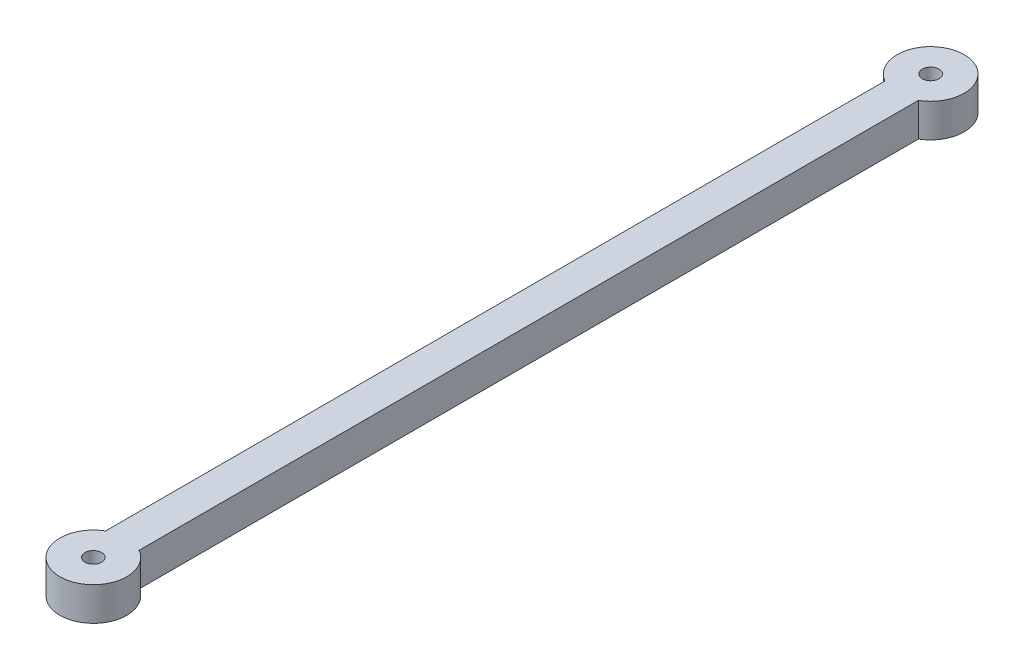
ISO-10303-21;
HEADER;
FILE_DESCRIPTION(('STEP AP214'),'2;1');
FILE_NAME('part.step','',(''),(''),'','','');
FILE_SCHEMA(('AUTOMOTIVE_DESIGN { 1 0 10303 214 1 1 1 1 }'));
ENDSEC;
DATA;
#1=APPLICATION_CONTEXT('core data for automotive mechanical design processes');
#2=APPLICATION_PROTOCOL_DEFINITION('international standard','automotive_design',2000,#1);
#3=PRODUCT_CONTEXT('',#1,'mechanical');
#4=PRODUCT('Part','Part','',(#3));
#5=PRODUCT_RELATED_PRODUCT_CATEGORY('part','',(#4));
#6=PRODUCT_DEFINITION_FORMATION('','',#4);
#7=PRODUCT_DEFINITION_CONTEXT('part definition',#1,'design');
#8=PRODUCT_DEFINITION('design','',#6,#7);
#9=PRODUCT_DEFINITION_SHAPE('','',#8);
#10=(LENGTH_UNIT() NAMED_UNIT(*) SI_UNIT(.MILLI.,.METRE.));
#11=(NAMED_UNIT(*) PLANE_ANGLE_UNIT() SI_UNIT($,.RADIAN.));
#12=(NAMED_UNIT(*) SI_UNIT($,.STERADIAN.) SOLID_ANGLE_UNIT());
#13=UNCERTAINTY_MEASURE_WITH_UNIT(LENGTH_MEASURE(1.E-05),#10,'distance_accuracy_value','');
#14=(GEOMETRIC_REPRESENTATION_CONTEXT(3) GLOBAL_UNCERTAINTY_ASSIGNED_CONTEXT((#13)) GLOBAL_UNIT_ASSIGNED_CONTEXT((#10,
#11,#12)) REPRESENTATION_CONTEXT('',''));
#15=CARTESIAN_POINT('',(0.,0.,0.));
#16=DIRECTION('',(0.,0.,1.));
#17=DIRECTION('',(1.,0.,0.));
#18=AXIS2_PLACEMENT_3D('',#15,#16,#17);
#19=CARTESIAN_POINT('',(0.,6.,-150.));
#20=DIRECTION('',(0.,-1.,0.));
#21=DIRECTION('',(0.,0.,-1.));
#22=AXIS2_PLACEMENT_3D('',#19,#20,#21);
#23=CYLINDRICAL_SURFACE('',#22,6.);
#24=CARTESIAN_POINT('',(0.,0.,-150.));
#25=DIRECTION('',(0.,1.,0.));
#26=DIRECTION('',(0.,0.,1.));
#27=AXIS2_PLACEMENT_3D('',#24,#25,#26);
#28=CIRCLE('',#27,6.);
#29=CARTESIAN_POINT('',(2.99999999999998,0.,-144.803847577293));
#30=VERTEX_POINT('',#29);
#31=CARTESIAN_POINT('',(-3.,0.,-144.803847577293));
#32=VERTEX_POINT('',#31);
#33=EDGE_CURVE('E110',#30,#32,#28,.T.);
#34=ORIENTED_EDGE('',*,*,#33,.T.);
#35=DIRECTION('',(0.,-1.,0.));
#36=VECTOR('',#35,1.);
#37=CARTESIAN_POINT('',(-3.,6.,-144.803847577293));
#38=LINE('',#37,#36);
#39=CARTESIAN_POINT('',(-3.,6.,-144.803847577293));
#40=VERTEX_POINT('',#39);
#41=EDGE_CURVE('E11',#40,#32,#38,.T.);
#42=ORIENTED_EDGE('',*,*,#41,.F.);
#43=CARTESIAN_POINT('',(0.,6.,-150.));
#44=DIRECTION('',(0.,1.,0.));
#45=DIRECTION('',(0.,0.,1.));
#46=AXIS2_PLACEMENT_3D('',#43,#44,#45);
#47=CIRCLE('',#46,6.);
#48=CARTESIAN_POINT('',(2.99999999999998,6.,-144.803847577293));
#49=VERTEX_POINT('',#48);
#50=EDGE_CURVE('E79',#49,#40,#47,.T.);
#51=ORIENTED_EDGE('',*,*,#50,.F.);
#52=DIRECTION('',(0.,-1.,0.));
#53=VECTOR('',#52,1.);
#54=CARTESIAN_POINT('',(2.99999999999998,6.,-144.803847577293));
#55=LINE('',#54,#53);
#56=EDGE_CURVE('E54',#49,#30,#55,.T.);
#57=ORIENTED_EDGE('',*,*,#56,.T.);
#58=EDGE_LOOP('',(#34,#42,#51,#57));
#59=FACE_BOUND('',#58,.T.);
#60=ADVANCED_FACE('F37',(#59),#23,.T.);
#61=CARTESIAN_POINT('',(-3.,6.,0.));
#62=DIRECTION('',(-1.,0.,0.));
#63=DIRECTION('',(0.,0.,1.));
#64=AXIS2_PLACEMENT_3D('',#61,#62,#63);
#65=PLANE('',#64);
#66=DIRECTION('',(0.,0.,-1.));
#67=VECTOR('',#66,1.);
#68=CARTESIAN_POINT('',(-3.,0.,0.));
#69=LINE('',#68,#67);
#70=CARTESIAN_POINT('',(-3.,0.,-5.19615242270663));
#71=VERTEX_POINT('',#70);
#72=EDGE_CURVE('E89',#71,#32,#69,.T.);
#73=ORIENTED_EDGE('',*,*,#72,.F.);
#74=DIRECTION('',(0.,-1.,0.));
#75=VECTOR('',#74,1.);
#76=CARTESIAN_POINT('',(-3.,6.,-5.19615242270663));
#77=LINE('',#76,#75);
#78=CARTESIAN_POINT('',(-3.,6.,-5.19615242270663));
#79=VERTEX_POINT('',#78);
#80=EDGE_CURVE('E46',#79,#71,#77,.T.);
#81=ORIENTED_EDGE('',*,*,#80,.F.);
#82=DIRECTION('',(0.,0.,-1.));
#83=VECTOR('',#82,1.);
#84=CARTESIAN_POINT('',(-3.,6.,0.));
#85=LINE('',#84,#83);
#86=EDGE_CURVE('E87',#79,#40,#85,.T.);
#87=ORIENTED_EDGE('',*,*,#86,.T.);
#88=ORIENTED_EDGE('',*,*,#41,.T.);
#89=EDGE_LOOP('',(#73,#81,#87,#88));
#90=FACE_BOUND('',#89,.T.);
#91=ADVANCED_FACE('F86',(#90),#65,.T.);
#92=CARTESIAN_POINT('',(0.,6.,0.));
#93=DIRECTION('',(0.,-1.,0.));
#94=DIRECTION('',(0.,0.,-1.));
#95=AXIS2_PLACEMENT_3D('',#92,#93,#94);
#96=CYLINDRICAL_SURFACE('',#95,6.);
#97=CARTESIAN_POINT('',(0.,0.,0.));
#98=DIRECTION('',(0.,1.,0.));
#99=DIRECTION('',(0.,0.,1.));
#100=AXIS2_PLACEMENT_3D('',#97,#98,#99);
#101=CIRCLE('',#100,6.);
#102=CARTESIAN_POINT('',(3.,0.,-5.19615242270663));
#103=VERTEX_POINT('',#102);
#104=EDGE_CURVE('E113',#71,#103,#101,.T.);
#105=ORIENTED_EDGE('',*,*,#104,.T.);
#106=DIRECTION('',(0.,-1.,0.));
#107=VECTOR('',#106,1.);
#108=CARTESIAN_POINT('',(3.,6.,-5.19615242270663));
#109=LINE('',#108,#107);
#110=CARTESIAN_POINT('',(3.,6.,-5.19615242270663));
#111=VERTEX_POINT('',#110);
#112=EDGE_CURVE('E68',#111,#103,#109,.T.);
#113=ORIENTED_EDGE('',*,*,#112,.F.);
#114=CARTESIAN_POINT('',(0.,6.,0.));
#115=DIRECTION('',(0.,1.,0.));
#116=DIRECTION('',(0.,0.,1.));
#117=AXIS2_PLACEMENT_3D('',#114,#115,#116);
#118=CIRCLE('',#117,6.);
#119=EDGE_CURVE('E92',#79,#111,#118,.T.);
#120=ORIENTED_EDGE('',*,*,#119,.F.);
#121=ORIENTED_EDGE('',*,*,#80,.T.);
#122=EDGE_LOOP('',(#105,#113,#120,#121));
#123=FACE_BOUND('',#122,.T.);
#124=ADVANCED_FACE('F93',(#123),#96,.T.);
#125=CARTESIAN_POINT('',(3.,6.,0.));
#126=DIRECTION('',(1.,0.,0.));
#127=DIRECTION('',(0.,0.,-1.));
#128=AXIS2_PLACEMENT_3D('',#125,#126,#127);
#129=PLANE('',#128);
#130=DIRECTION('',(0.,0.,1.));
#131=VECTOR('',#130,1.);
#132=CARTESIAN_POINT('',(3.,0.,0.));
#133=LINE('',#132,#131);
#134=EDGE_CURVE('E115',#30,#103,#133,.T.);
#135=ORIENTED_EDGE('',*,*,#134,.F.);
#136=ORIENTED_EDGE('',*,*,#56,.F.);
#137=DIRECTION('',(0.,0.,1.));
#138=VECTOR('',#137,1.);
#139=CARTESIAN_POINT('',(3.,6.,0.));
#140=LINE('',#139,#138);
#141=EDGE_CURVE('E94',#49,#111,#140,.T.);
#142=ORIENTED_EDGE('',*,*,#141,.T.);
#143=ORIENTED_EDGE('',*,*,#112,.T.);
#144=EDGE_LOOP('',(#135,#136,#142,#143));
#145=FACE_BOUND('',#144,.T.);
#146=ADVANCED_FACE('F149',(#145),#129,.T.);
#147=CARTESIAN_POINT('',(0.,6.,-150.));
#148=DIRECTION('',(0.,-1.,0.));
#149=DIRECTION('',(0.,0.,-1.));
#150=AXIS2_PLACEMENT_3D('',#147,#148,#149);
#151=CYLINDRICAL_SURFACE('',#150,1.5);
#152=CARTESIAN_POINT('',(0.,6.,-150.));
#153=DIRECTION('',(0.,1.,0.));
#154=DIRECTION('',(0.,0.,1.));
#155=AXIS2_PLACEMENT_3D('',#152,#153,#154);
#156=CIRCLE('',#155,1.5);
#157=CARTESIAN_POINT('',(0.,6.,-148.5));
#158=VERTEX_POINT('',#157);
#159=EDGE_CURVE('E99',#158,#158,#156,.T.);
#160=ORIENTED_EDGE('',*,*,#159,.T.);
#161=EDGE_LOOP('',(#160));
#162=FACE_BOUND('',#161,.T.);
#163=CARTESIAN_POINT('',(0.,0.,-150.));
#164=DIRECTION('',(0.,1.,0.));
#165=DIRECTION('',(0.,0.,1.));
#166=AXIS2_PLACEMENT_3D('',#163,#164,#165);
#167=CIRCLE('',#166,1.5);
#168=CARTESIAN_POINT('',(0.,0.,-148.5));
#169=VERTEX_POINT('',#168);
#170=EDGE_CURVE('E107',#169,#169,#167,.T.);
#171=ORIENTED_EDGE('',*,*,#170,.F.);
#172=EDGE_LOOP('',(#171));
#173=FACE_BOUND('',#172,.T.);
#174=ADVANCED_FACE('F39',(#162,#173),#151,.F.);
#175=CARTESIAN_POINT('',(0.,6.,0.));
#176=DIRECTION('',(0.,-1.,0.));
#177=DIRECTION('',(0.,0.,-1.));
#178=AXIS2_PLACEMENT_3D('',#175,#176,#177);
#179=CYLINDRICAL_SURFACE('',#178,1.5);
#180=CARTESIAN_POINT('',(0.,6.,0.));
#181=DIRECTION('',(0.,1.,0.));
#182=DIRECTION('',(0.,0.,1.));
#183=AXIS2_PLACEMENT_3D('',#180,#181,#182);
#184=CIRCLE('',#183,1.5);
#185=CARTESIAN_POINT('',(0.,6.,1.5));
#186=VERTEX_POINT('',#185);
#187=EDGE_CURVE('E104',#186,#186,#184,.T.);
#188=ORIENTED_EDGE('',*,*,#187,.T.);
#189=EDGE_LOOP('',(#188));
#190=FACE_BOUND('',#189,.T.);
#191=CARTESIAN_POINT('',(0.,0.,0.));
#192=DIRECTION('',(0.,1.,0.));
#193=DIRECTION('',(0.,0.,1.));
#194=AXIS2_PLACEMENT_3D('',#191,#192,#193);
#195=CIRCLE('',#194,1.5);
#196=CARTESIAN_POINT('',(0.,0.,1.5));
#197=VERTEX_POINT('',#196);
#198=EDGE_CURVE('E118',#197,#197,#195,.T.);
#199=ORIENTED_EDGE('',*,*,#198,.F.);
#200=EDGE_LOOP('',(#199));
#201=FACE_BOUND('',#200,.T.);
#202=ADVANCED_FACE('F131',(#190,#201),#179,.F.);
#203=CARTESIAN_POINT('',(0.,6.,0.));
#204=DIRECTION('',(0.,1.,0.));
#205=DIRECTION('',(0.,0.,1.));
#206=AXIS2_PLACEMENT_3D('',#203,#204,#205);
#207=PLANE('',#206);
#208=ORIENTED_EDGE('',*,*,#159,.F.);
#209=EDGE_LOOP('',(#208));
#210=FACE_BOUND('',#209,.T.);
#211=ORIENTED_EDGE('',*,*,#50,.T.);
#212=ORIENTED_EDGE('',*,*,#86,.F.);
#213=ORIENTED_EDGE('',*,*,#119,.T.);
#214=ORIENTED_EDGE('',*,*,#141,.F.);
#215=EDGE_LOOP('',(#211,#212,#213,#214));
#216=FACE_BOUND('',#215,.T.);
#217=ORIENTED_EDGE('',*,*,#187,.F.);
#218=EDGE_LOOP('',(#217));
#219=FACE_BOUND('',#218,.T.);
#220=ADVANCED_FACE('F96',(#210,#216,#219),#207,.T.);
#221=CARTESIAN_POINT('',(0.,0.,0.));
#222=DIRECTION('',(0.,1.,0.));
#223=DIRECTION('',(0.,0.,1.));
#224=AXIS2_PLACEMENT_3D('',#221,#222,#223);
#225=PLANE('',#224);
#226=ORIENTED_EDGE('',*,*,#170,.T.);
#227=EDGE_LOOP('',(#226));
#228=FACE_BOUND('',#227,.T.);
#229=ORIENTED_EDGE('',*,*,#33,.F.);
#230=ORIENTED_EDGE('',*,*,#134,.T.);
#231=ORIENTED_EDGE('',*,*,#104,.F.);
#232=ORIENTED_EDGE('',*,*,#72,.T.);
#233=EDGE_LOOP('',(#229,#230,#231,#232));
#234=FACE_BOUND('',#233,.T.);
#235=ORIENTED_EDGE('',*,*,#198,.T.);
#236=EDGE_LOOP('',(#235));
#237=FACE_BOUND('',#236,.T.);
#238=ADVANCED_FACE('F130',(#228,#234,#237),#225,.F.);
#239=CLOSED_SHELL('',(#60,#91,#124,#146,#174,#202,#220,#238));
#240=MANIFOLD_SOLID_BREP('B2',#239);
#241=ADVANCED_BREP_SHAPE_REPRESENTATION('',(#18,#240),#14);
#242=SHAPE_DEFINITION_REPRESENTATION(#9,#241);
ENDSEC;
END-ISO-10303-21;
